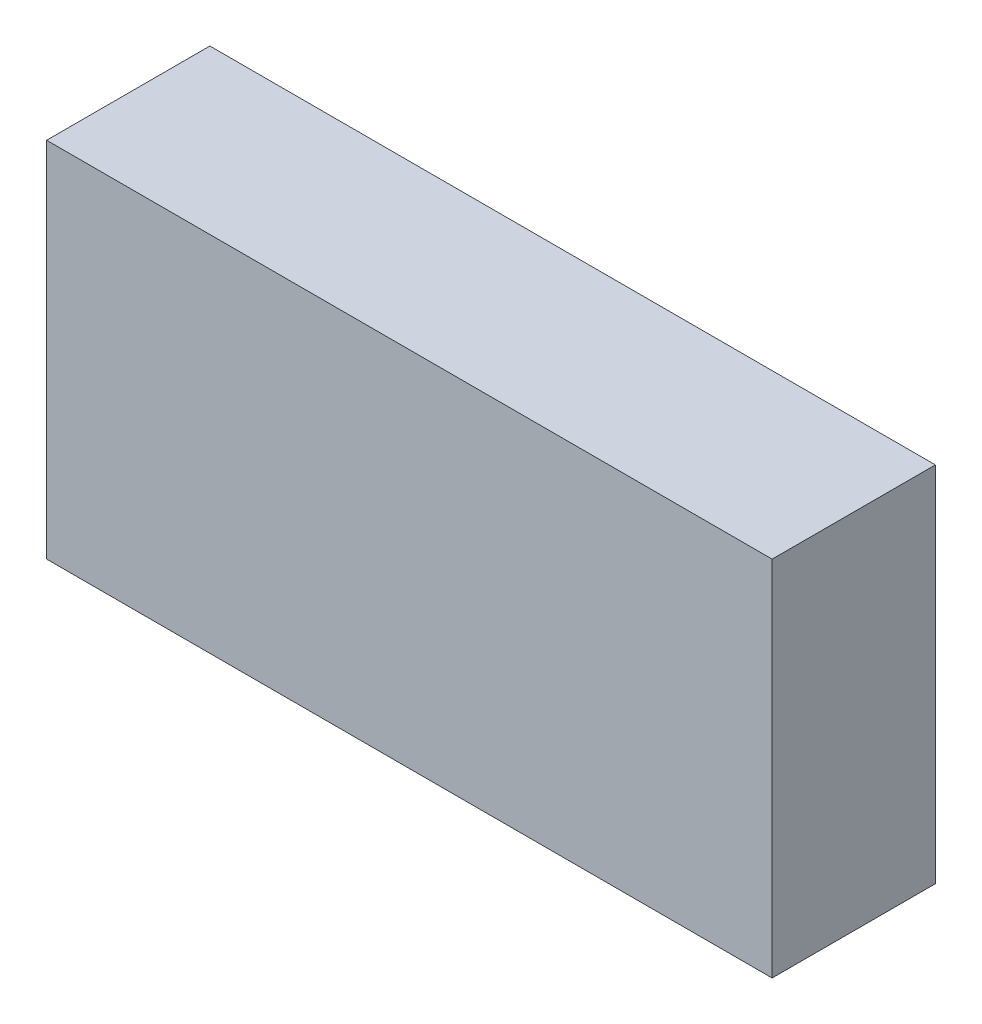
ISO-10303-21;
HEADER;
FILE_DESCRIPTION(('STEP AP214'),'2;1');
FILE_NAME('part.step','',(''),(''),'','','');
FILE_SCHEMA(('AUTOMOTIVE_DESIGN { 1 0 10303 214 1 1 1 1 }'));
ENDSEC;
DATA;
#1=APPLICATION_CONTEXT('core data for automotive mechanical design processes');
#2=APPLICATION_PROTOCOL_DEFINITION('international standard','automotive_design',2000,#1);
#3=PRODUCT_CONTEXT('',#1,'mechanical');
#4=PRODUCT('Part','Part','',(#3));
#5=PRODUCT_RELATED_PRODUCT_CATEGORY('part','',(#4));
#6=PRODUCT_DEFINITION_FORMATION('','',#4);
#7=PRODUCT_DEFINITION_CONTEXT('part definition',#1,'design');
#8=PRODUCT_DEFINITION('design','',#6,#7);
#9=PRODUCT_DEFINITION_SHAPE('','',#8);
#10=(LENGTH_UNIT() NAMED_UNIT(*) SI_UNIT(.MILLI.,.METRE.));
#11=(NAMED_UNIT(*) PLANE_ANGLE_UNIT() SI_UNIT($,.RADIAN.));
#12=(NAMED_UNIT(*) SI_UNIT($,.STERADIAN.) SOLID_ANGLE_UNIT());
#13=UNCERTAINTY_MEASURE_WITH_UNIT(LENGTH_MEASURE(1.E-05),#10,'distance_accuracy_value','');
#14=(GEOMETRIC_REPRESENTATION_CONTEXT(3) GLOBAL_UNCERTAINTY_ASSIGNED_CONTEXT((#13)) GLOBAL_UNIT_ASSIGNED_CONTEXT((#10,
#11,#12)) REPRESENTATION_CONTEXT('',''));
#15=CARTESIAN_POINT('',(0.,0.,0.));
#16=DIRECTION('',(0.,0.,1.));
#17=DIRECTION('',(1.,0.,0.));
#18=AXIS2_PLACEMENT_3D('',#15,#16,#17);
#19=CARTESIAN_POINT('',(-0.366,0.4152,0.508));
#20=DIRECTION('',(0.,0.,1.));
#21=DIRECTION('',(1.,0.,0.));
#22=AXIS2_PLACEMENT_3D('',#19,#20,#21);
#23=PLANE('',#22);
#24=DIRECTION('',(0.,1.,0.));
#25=VECTOR('',#24,1.);
#26=CARTESIAN_POINT('',(1.666,0.4152,0.508));
#27=LINE('',#26,#25);
#28=CARTESIAN_POINT('',(1.666,1.4312,0.508));
#29=VERTEX_POINT('',#28);
#30=CARTESIAN_POINT('',(1.666,0.4152,0.508));
#31=VERTEX_POINT('',#30);
#32=EDGE_CURVE('E75',#29,#31,#27,.F.);
#33=ORIENTED_EDGE('',*,*,#32,.F.);
#34=DIRECTION('',(1.,0.,0.));
#35=VECTOR('',#34,1.);
#36=CARTESIAN_POINT('',(-0.366,1.4312,0.508));
#37=LINE('',#36,#35);
#38=CARTESIAN_POINT('',(-0.366,1.4312,0.508));
#39=VERTEX_POINT('',#38);
#40=EDGE_CURVE('E57',#39,#29,#37,.T.);
#41=ORIENTED_EDGE('',*,*,#40,.F.);
#42=DIRECTION('',(0.,1.,0.));
#43=VECTOR('',#42,1.);
#44=CARTESIAN_POINT('',(-0.366,0.4152,0.508));
#45=LINE('',#44,#43);
#46=CARTESIAN_POINT('',(-0.366,0.4152,0.508));
#47=VERTEX_POINT('',#46);
#48=EDGE_CURVE('E19',#39,#47,#45,.F.);
#49=ORIENTED_EDGE('',*,*,#48,.T.);
#50=DIRECTION('',(1.,0.,0.));
#51=VECTOR('',#50,1.);
#52=CARTESIAN_POINT('',(-0.366,0.4152,0.508));
#53=LINE('',#52,#51);
#54=EDGE_CURVE('E54',#47,#31,#53,.T.);
#55=ORIENTED_EDGE('',*,*,#54,.T.);
#56=EDGE_LOOP('',(#33,#41,#49,#55));
#57=FACE_BOUND('',#56,.T.);
#58=ADVANCED_FACE('F16',(#57),#23,.T.);
#59=CARTESIAN_POINT('',(-0.366,0.4152,0.0508));
#60=DIRECTION('',(1.,0.,0.));
#61=DIRECTION('',(0.,0.,-1.));
#62=AXIS2_PLACEMENT_3D('',#59,#60,#61);
#63=PLANE('',#62);
#64=DIRECTION('',(0.,0.,1.));
#65=VECTOR('',#64,1.);
#66=CARTESIAN_POINT('',(-0.366,1.4312,0.0508));
#67=LINE('',#66,#65);
#68=CARTESIAN_POINT('',(-0.366,1.4312,0.0508));
#69=VERTEX_POINT('',#68);
#70=EDGE_CURVE('E77',#69,#39,#67,.T.);
#71=ORIENTED_EDGE('',*,*,#70,.F.);
#72=DIRECTION('',(0.,1.,0.));
#73=VECTOR('',#72,1.);
#74=CARTESIAN_POINT('',(-0.366,0.4152,0.0508));
#75=LINE('',#74,#73);
#76=CARTESIAN_POINT('',(-0.366,0.4152,0.0508));
#77=VERTEX_POINT('',#76);
#78=EDGE_CURVE('E72',#69,#77,#75,.F.);
#79=ORIENTED_EDGE('',*,*,#78,.T.);
#80=DIRECTION('',(0.,0.,1.));
#81=VECTOR('',#80,1.);
#82=CARTESIAN_POINT('',(-0.366,0.4152,0.0508));
#83=LINE('',#82,#81);
#84=EDGE_CURVE('E62',#77,#47,#83,.T.);
#85=ORIENTED_EDGE('',*,*,#84,.T.);
#86=ORIENTED_EDGE('',*,*,#48,.F.);
#87=EDGE_LOOP('',(#71,#79,#85,#86));
#88=FACE_BOUND('',#87,.T.);
#89=ADVANCED_FACE('F71',(#88),#63,.F.);
#90=CARTESIAN_POINT('',(-0.366,0.4152,0.0508));
#91=DIRECTION('',(0.,1.,0.));
#92=DIRECTION('',(0.,0.,1.));
#93=AXIS2_PLACEMENT_3D('',#90,#91,#92);
#94=PLANE('',#93);
#95=ORIENTED_EDGE('',*,*,#54,.F.);
#96=ORIENTED_EDGE('',*,*,#84,.F.);
#97=DIRECTION('',(1.,0.,0.));
#98=VECTOR('',#97,1.);
#99=CARTESIAN_POINT('',(-0.366,0.4152,0.0508));
#100=LINE('',#99,#98);
#101=CARTESIAN_POINT('',(1.666,0.4152,0.0508));
#102=VERTEX_POINT('',#101);
#103=EDGE_CURVE('E82',#77,#102,#100,.T.);
#104=ORIENTED_EDGE('',*,*,#103,.T.);
#105=DIRECTION('',(0.,0.,-1.));
#106=VECTOR('',#105,1.);
#107=CARTESIAN_POINT('',(1.666,0.4152,0.0508));
#108=LINE('',#107,#106);
#109=EDGE_CURVE('E68',#31,#102,#108,.T.);
#110=ORIENTED_EDGE('',*,*,#109,.F.);
#111=EDGE_LOOP('',(#95,#96,#104,#110));
#112=FACE_BOUND('',#111,.T.);
#113=ADVANCED_FACE('F65',(#112),#94,.F.);
#114=CARTESIAN_POINT('',(1.666,0.4152,0.0508));
#115=DIRECTION('',(1.,0.,0.));
#116=DIRECTION('',(0.,0.,-1.));
#117=AXIS2_PLACEMENT_3D('',#114,#115,#116);
#118=PLANE('',#117);
#119=DIRECTION('',(0.,0.,1.));
#120=VECTOR('',#119,1.);
#121=CARTESIAN_POINT('',(1.666,1.4312,0.0508));
#122=LINE('',#121,#120);
#123=CARTESIAN_POINT('',(1.666,1.4312,0.0508));
#124=VERTEX_POINT('',#123);
#125=EDGE_CURVE('E33',#29,#124,#122,.F.);
#126=ORIENTED_EDGE('',*,*,#125,.F.);
#127=ORIENTED_EDGE('',*,*,#32,.T.);
#128=ORIENTED_EDGE('',*,*,#109,.T.);
#129=DIRECTION('',(0.,1.,0.));
#130=VECTOR('',#129,1.);
#131=CARTESIAN_POINT('',(1.666,0.4152,0.0508));
#132=LINE('',#131,#130);
#133=EDGE_CURVE('E25',#102,#124,#132,.T.);
#134=ORIENTED_EDGE('',*,*,#133,.T.);
#135=EDGE_LOOP('',(#126,#127,#128,#134));
#136=FACE_BOUND('',#135,.T.);
#137=ADVANCED_FACE('F87',(#136),#118,.T.);
#138=CARTESIAN_POINT('',(-0.366,1.4312,0.0508));
#139=DIRECTION('',(0.,1.,0.));
#140=DIRECTION('',(0.,0.,1.));
#141=AXIS2_PLACEMENT_3D('',#138,#139,#140);
#142=PLANE('',#141);
#143=ORIENTED_EDGE('',*,*,#40,.T.);
#144=ORIENTED_EDGE('',*,*,#125,.T.);
#145=DIRECTION('',(1.,0.,0.));
#146=VECTOR('',#145,1.);
#147=CARTESIAN_POINT('',(-0.366,1.4312,0.0508));
#148=LINE('',#147,#146);
#149=EDGE_CURVE('E11',#124,#69,#148,.F.);
#150=ORIENTED_EDGE('',*,*,#149,.T.);
#151=ORIENTED_EDGE('',*,*,#70,.T.);
#152=EDGE_LOOP('',(#143,#144,#150,#151));
#153=FACE_BOUND('',#152,.T.);
#154=ADVANCED_FACE('F90',(#153),#142,.T.);
#155=CARTESIAN_POINT('',(-0.366,0.4152,0.0508));
#156=DIRECTION('',(0.,0.,1.));
#157=DIRECTION('',(1.,0.,0.));
#158=AXIS2_PLACEMENT_3D('',#155,#156,#157);
#159=PLANE('',#158);
#160=ORIENTED_EDGE('',*,*,#133,.F.);
#161=ORIENTED_EDGE('',*,*,#103,.F.);
#162=ORIENTED_EDGE('',*,*,#78,.F.);
#163=ORIENTED_EDGE('',*,*,#149,.F.);
#164=EDGE_LOOP('',(#160,#161,#162,#163));
#165=FACE_BOUND('',#164,.T.);
#166=ADVANCED_FACE('F89',(#165),#159,.F.);
#167=CLOSED_SHELL('',(#58,#89,#113,#137,#154,#166));
#168=MANIFOLD_SOLID_BREP('B1',#167);
#169=ADVANCED_BREP_SHAPE_REPRESENTATION('',(#18,#168),#14);
#170=SHAPE_DEFINITION_REPRESENTATION(#9,#169);
ENDSEC;
END-ISO-10303-21;
